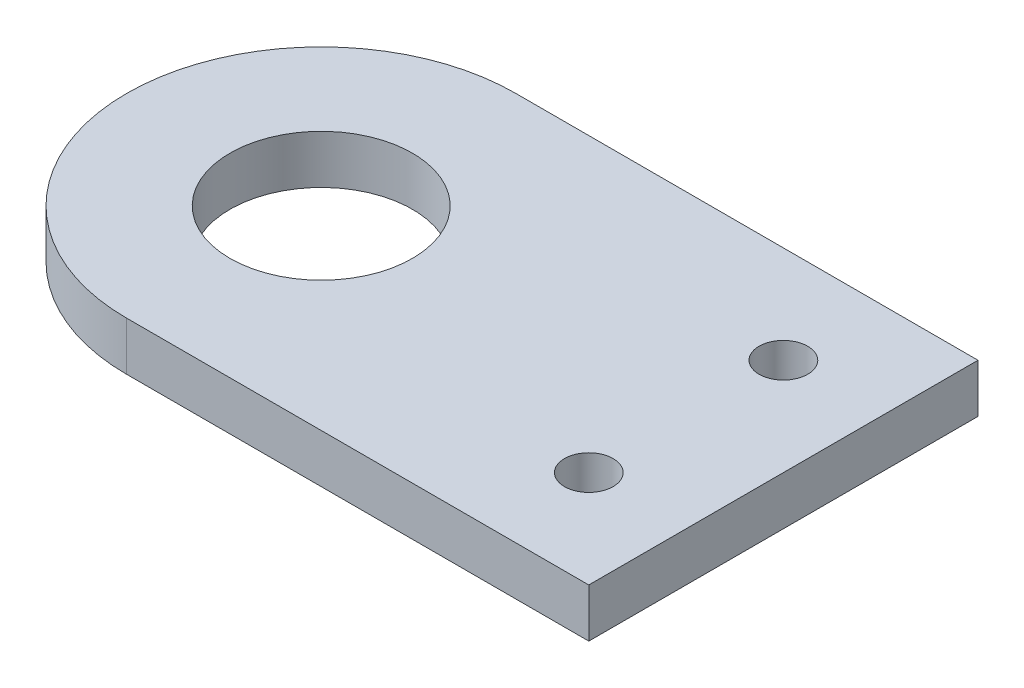
ISO-10303-21;
HEADER;
FILE_DESCRIPTION(('STEP AP214'),'2;1');
FILE_NAME('part.step','',(''),(''),'','','');
FILE_SCHEMA(('AUTOMOTIVE_DESIGN { 1 0 10303 214 1 1 1 1 }'));
ENDSEC;
DATA;
#1=APPLICATION_CONTEXT('core data for automotive mechanical design processes');
#2=APPLICATION_PROTOCOL_DEFINITION('international standard','automotive_design',2000,#1);
#3=PRODUCT_CONTEXT('',#1,'mechanical');
#4=PRODUCT('Part','Part','',(#3));
#5=PRODUCT_RELATED_PRODUCT_CATEGORY('part','',(#4));
#6=PRODUCT_DEFINITION_FORMATION('','',#4);
#7=PRODUCT_DEFINITION_CONTEXT('part definition',#1,'design');
#8=PRODUCT_DEFINITION('design','',#6,#7);
#9=PRODUCT_DEFINITION_SHAPE('','',#8);
#10=(LENGTH_UNIT() NAMED_UNIT(*) SI_UNIT(.MILLI.,.METRE.));
#11=(NAMED_UNIT(*) PLANE_ANGLE_UNIT() SI_UNIT($,.RADIAN.));
#12=(NAMED_UNIT(*) SI_UNIT($,.STERADIAN.) SOLID_ANGLE_UNIT());
#13=UNCERTAINTY_MEASURE_WITH_UNIT(LENGTH_MEASURE(1.E-05),#10,'distance_accuracy_value','');
#14=(GEOMETRIC_REPRESENTATION_CONTEXT(3) GLOBAL_UNCERTAINTY_ASSIGNED_CONTEXT((#13)) GLOBAL_UNIT_ASSIGNED_CONTEXT((#10,
#11,#12)) REPRESENTATION_CONTEXT('',''));
#15=CARTESIAN_POINT('',(0.,0.,0.));
#16=DIRECTION('',(0.,0.,1.));
#17=DIRECTION('',(1.,0.,0.));
#18=AXIS2_PLACEMENT_3D('',#15,#16,#17);
#19=CARTESIAN_POINT('',(0.,4.,0.));
#20=DIRECTION('',(0.,-1.,0.));
#21=DIRECTION('',(0.,0.,-1.));
#22=AXIS2_PLACEMENT_3D('',#19,#20,#21);
#23=CYLINDRICAL_SURFACE('',#22,16.);
#24=CARTESIAN_POINT('',(0.,0.,0.));
#25=DIRECTION('',(0.,1.,0.));
#26=DIRECTION('',(0.,0.,1.));
#27=AXIS2_PLACEMENT_3D('',#24,#25,#26);
#28=CIRCLE('',#27,16.);
#29=CARTESIAN_POINT('',(0.,0.,-16.));
#30=VERTEX_POINT('',#29);
#31=CARTESIAN_POINT('',(0.,0.,16.));
#32=VERTEX_POINT('',#31);
#33=EDGE_CURVE('E103',#30,#32,#28,.T.);
#34=ORIENTED_EDGE('',*,*,#33,.T.);
#35=DIRECTION('',(0.,-1.,0.));
#36=VECTOR('',#35,1.);
#37=CARTESIAN_POINT('',(0.,4.,16.));
#38=LINE('',#37,#36);
#39=CARTESIAN_POINT('',(0.,4.,16.));
#40=VERTEX_POINT('',#39);
#41=EDGE_CURVE('E12',#40,#32,#38,.T.);
#42=ORIENTED_EDGE('',*,*,#41,.F.);
#43=CARTESIAN_POINT('',(0.,4.,0.));
#44=DIRECTION('',(0.,1.,0.));
#45=DIRECTION('',(0.,0.,1.));
#46=AXIS2_PLACEMENT_3D('',#43,#44,#45);
#47=CIRCLE('',#46,16.);
#48=CARTESIAN_POINT('',(0.,4.,-16.));
#49=VERTEX_POINT('',#48);
#50=EDGE_CURVE('E77',#49,#40,#47,.T.);
#51=ORIENTED_EDGE('',*,*,#50,.F.);
#52=DIRECTION('',(0.,-1.,0.));
#53=VECTOR('',#52,1.);
#54=CARTESIAN_POINT('',(0.,4.,-16.));
#55=LINE('',#54,#53);
#56=EDGE_CURVE('E53',#49,#30,#55,.T.);
#57=ORIENTED_EDGE('',*,*,#56,.T.);
#58=EDGE_LOOP('',(#34,#42,#51,#57));
#59=FACE_BOUND('',#58,.T.);
#60=ADVANCED_FACE('F36',(#59),#23,.T.);
#61=CARTESIAN_POINT('',(0.,4.,16.));
#62=DIRECTION('',(0.,0.,1.));
#63=DIRECTION('',(1.,0.,0.));
#64=AXIS2_PLACEMENT_3D('',#61,#62,#63);
#65=PLANE('',#64);
#66=DIRECTION('',(-1.,0.,0.));
#67=VECTOR('',#66,1.);
#68=CARTESIAN_POINT('',(0.,0.,16.));
#69=LINE('',#68,#67);
#70=CARTESIAN_POINT('',(38.,0.,16.));
#71=VERTEX_POINT('',#70);
#72=EDGE_CURVE('E86',#71,#32,#69,.T.);
#73=ORIENTED_EDGE('',*,*,#72,.F.);
#74=DIRECTION('',(0.,-1.,0.));
#75=VECTOR('',#74,1.);
#76=CARTESIAN_POINT('',(38.,4.,16.));
#77=LINE('',#76,#75);
#78=CARTESIAN_POINT('',(38.,4.,16.));
#79=VERTEX_POINT('',#78);
#80=EDGE_CURVE('E45',#79,#71,#77,.T.);
#81=ORIENTED_EDGE('',*,*,#80,.F.);
#82=DIRECTION('',(-1.,0.,0.));
#83=VECTOR('',#82,1.);
#84=CARTESIAN_POINT('',(0.,4.,16.));
#85=LINE('',#84,#83);
#86=EDGE_CURVE('E84',#79,#40,#85,.T.);
#87=ORIENTED_EDGE('',*,*,#86,.T.);
#88=ORIENTED_EDGE('',*,*,#41,.T.);
#89=EDGE_LOOP('',(#73,#81,#87,#88));
#90=FACE_BOUND('',#89,.T.);
#91=ADVANCED_FACE('F83',(#90),#65,.T.);
#92=CARTESIAN_POINT('',(38.,4.,0.));
#93=DIRECTION('',(1.,0.,0.));
#94=DIRECTION('',(0.,0.,-1.));
#95=AXIS2_PLACEMENT_3D('',#92,#93,#94);
#96=PLANE('',#95);
#97=DIRECTION('',(0.,0.,1.));
#98=VECTOR('',#97,1.);
#99=CARTESIAN_POINT('',(38.,0.,0.));
#100=LINE('',#99,#98);
#101=CARTESIAN_POINT('',(38.,0.,-16.));
#102=VERTEX_POINT('',#101);
#103=EDGE_CURVE('E107',#102,#71,#100,.T.);
#104=ORIENTED_EDGE('',*,*,#103,.F.);
#105=DIRECTION('',(0.,-1.,0.));
#106=VECTOR('',#105,1.);
#107=CARTESIAN_POINT('',(38.,4.,-16.));
#108=LINE('',#107,#106);
#109=CARTESIAN_POINT('',(38.,4.,-16.));
#110=VERTEX_POINT('',#109);
#111=EDGE_CURVE('E66',#110,#102,#108,.T.);
#112=ORIENTED_EDGE('',*,*,#111,.F.);
#113=DIRECTION('',(0.,0.,1.));
#114=VECTOR('',#113,1.);
#115=CARTESIAN_POINT('',(38.,4.,0.));
#116=LINE('',#115,#114);
#117=EDGE_CURVE('E92',#110,#79,#116,.T.);
#118=ORIENTED_EDGE('',*,*,#117,.T.);
#119=ORIENTED_EDGE('',*,*,#80,.T.);
#120=EDGE_LOOP('',(#104,#112,#118,#119));
#121=FACE_BOUND('',#120,.T.);
#122=ADVANCED_FACE('F94',(#121),#96,.T.);
#123=CARTESIAN_POINT('',(0.,4.,0.));
#124=DIRECTION('',(0.,-1.,0.));
#125=DIRECTION('',(0.,0.,-1.));
#126=AXIS2_PLACEMENT_3D('',#123,#124,#125);
#127=CYLINDRICAL_SURFACE('',#126,7.5);
#128=CARTESIAN_POINT('',(0.,4.,0.));
#129=DIRECTION('',(0.,1.,0.));
#130=DIRECTION('',(0.,0.,1.));
#131=AXIS2_PLACEMENT_3D('',#128,#129,#130);
#132=CIRCLE('',#131,7.5);
#133=CARTESIAN_POINT('',(0.,4.,7.5));
#134=VERTEX_POINT('',#133);
#135=EDGE_CURVE('E112',#134,#134,#132,.T.);
#136=ORIENTED_EDGE('',*,*,#135,.T.);
#137=EDGE_LOOP('',(#136));
#138=FACE_BOUND('',#137,.T.);
#139=CARTESIAN_POINT('',(0.,0.,0.));
#140=DIRECTION('',(0.,1.,0.));
#141=DIRECTION('',(0.,0.,1.));
#142=AXIS2_PLACEMENT_3D('',#139,#140,#141);
#143=CIRCLE('',#142,7.5);
#144=CARTESIAN_POINT('',(0.,0.,7.5));
#145=VERTEX_POINT('',#144);
#146=EDGE_CURVE('E100',#145,#145,#143,.T.);
#147=ORIENTED_EDGE('',*,*,#146,.F.);
#148=EDGE_LOOP('',(#147));
#149=FACE_BOUND('',#148,.T.);
#150=ADVANCED_FACE('F38',(#138,#149),#127,.F.);
#151=CARTESIAN_POINT('',(0.,4.,-16.));
#152=DIRECTION('',(0.,0.,-1.));
#153=DIRECTION('',(-1.,0.,0.));
#154=AXIS2_PLACEMENT_3D('',#151,#152,#153);
#155=PLANE('',#154);
#156=DIRECTION('',(1.,0.,0.));
#157=VECTOR('',#156,1.);
#158=CARTESIAN_POINT('',(0.,0.,-16.));
#159=LINE('',#158,#157);
#160=EDGE_CURVE('E109',#30,#102,#159,.T.);
#161=ORIENTED_EDGE('',*,*,#160,.F.);
#162=ORIENTED_EDGE('',*,*,#56,.F.);
#163=DIRECTION('',(1.,0.,0.));
#164=VECTOR('',#163,1.);
#165=CARTESIAN_POINT('',(0.,4.,-16.));
#166=LINE('',#165,#164);
#167=EDGE_CURVE('E95',#49,#110,#166,.T.);
#168=ORIENTED_EDGE('',*,*,#167,.T.);
#169=ORIENTED_EDGE('',*,*,#111,.T.);
#170=EDGE_LOOP('',(#161,#162,#168,#169));
#171=FACE_BOUND('',#170,.T.);
#172=ADVANCED_FACE('F144',(#171),#155,.T.);
#173=CARTESIAN_POINT('',(0.,4.,0.));
#174=DIRECTION('',(0.,1.,0.));
#175=DIRECTION('',(0.,0.,1.));
#176=AXIS2_PLACEMENT_3D('',#173,#174,#175);
#177=PLANE('',#176);
#178=CARTESIAN_POINT('',(30.,4.,8.));
#179=DIRECTION('',(0.,1.,0.));
#180=DIRECTION('',(0.,0.,1.));
#181=AXIS2_PLACEMENT_3D('',#178,#179,#180);
#182=CIRCLE('',#181,2.);
#183=CARTESIAN_POINT('',(30.,4.,10.));
#184=VERTEX_POINT('',#183);
#185=EDGE_CURVE('E126',#184,#184,#182,.T.);
#186=ORIENTED_EDGE('',*,*,#185,.F.);
#187=EDGE_LOOP('',(#186));
#188=FACE_BOUND('',#187,.T.);
#189=CARTESIAN_POINT('',(30.,4.,-8.));
#190=DIRECTION('',(0.,1.,0.));
#191=DIRECTION('',(0.,0.,1.));
#192=AXIS2_PLACEMENT_3D('',#189,#190,#191);
#193=CIRCLE('',#192,2.);
#194=CARTESIAN_POINT('',(30.,4.,-6.));
#195=VERTEX_POINT('',#194);
#196=EDGE_CURVE('E120',#195,#195,#193,.T.);
#197=ORIENTED_EDGE('',*,*,#196,.F.);
#198=EDGE_LOOP('',(#197));
#199=FACE_BOUND('',#198,.T.);
#200=ORIENTED_EDGE('',*,*,#135,.F.);
#201=EDGE_LOOP('',(#200));
#202=FACE_BOUND('',#201,.T.);
#203=ORIENTED_EDGE('',*,*,#50,.T.);
#204=ORIENTED_EDGE('',*,*,#86,.F.);
#205=ORIENTED_EDGE('',*,*,#117,.F.);
#206=ORIENTED_EDGE('',*,*,#167,.F.);
#207=EDGE_LOOP('',(#203,#204,#205,#206));
#208=FACE_BOUND('',#207,.T.);
#209=ADVANCED_FACE('F91',(#188,#199,#202,#208),#177,.T.);
#210=CARTESIAN_POINT('',(0.,0.,0.));
#211=DIRECTION('',(0.,1.,0.));
#212=DIRECTION('',(0.,0.,1.));
#213=AXIS2_PLACEMENT_3D('',#210,#211,#212);
#214=PLANE('',#213);
#215=CARTESIAN_POINT('',(30.,0.,8.));
#216=DIRECTION('',(0.,1.,0.));
#217=DIRECTION('',(0.,0.,1.));
#218=AXIS2_PLACEMENT_3D('',#215,#216,#217);
#219=CIRCLE('',#218,2.);
#220=CARTESIAN_POINT('',(30.,0.,10.));
#221=VERTEX_POINT('',#220);
#222=EDGE_CURVE('E104',#221,#221,#219,.T.);
#223=ORIENTED_EDGE('',*,*,#222,.T.);
#224=EDGE_LOOP('',(#223));
#225=FACE_BOUND('',#224,.T.);
#226=CARTESIAN_POINT('',(30.,0.,-8.));
#227=DIRECTION('',(0.,1.,0.));
#228=DIRECTION('',(0.,0.,1.));
#229=AXIS2_PLACEMENT_3D('',#226,#227,#228);
#230=CIRCLE('',#229,2.);
#231=CARTESIAN_POINT('',(30.,0.,-6.));
#232=VERTEX_POINT('',#231);
#233=EDGE_CURVE('E123',#232,#232,#230,.T.);
#234=ORIENTED_EDGE('',*,*,#233,.T.);
#235=EDGE_LOOP('',(#234));
#236=FACE_BOUND('',#235,.T.);
#237=ORIENTED_EDGE('',*,*,#146,.T.);
#238=EDGE_LOOP('',(#237));
#239=FACE_BOUND('',#238,.T.);
#240=ORIENTED_EDGE('',*,*,#33,.F.);
#241=ORIENTED_EDGE('',*,*,#160,.T.);
#242=ORIENTED_EDGE('',*,*,#103,.T.);
#243=ORIENTED_EDGE('',*,*,#72,.T.);
#244=EDGE_LOOP('',(#240,#241,#242,#243));
#245=FACE_BOUND('',#244,.T.);
#246=ADVANCED_FACE('F132',(#225,#236,#239,#245),#214,.F.);
#247=CARTESIAN_POINT('',(30.,0.,-8.));
#248=DIRECTION('',(0.,1.,0.));
#249=DIRECTION('',(0.,0.,1.));
#250=AXIS2_PLACEMENT_3D('',#247,#248,#249);
#251=CYLINDRICAL_SURFACE('',#250,2.);
#252=ORIENTED_EDGE('',*,*,#233,.F.);
#253=EDGE_LOOP('',(#252));
#254=FACE_BOUND('',#253,.T.);
#255=ORIENTED_EDGE('',*,*,#196,.T.);
#256=EDGE_LOOP('',(#255));
#257=FACE_BOUND('',#256,.T.);
#258=ADVANCED_FACE('F138',(#254,#257),#251,.F.);
#259=CARTESIAN_POINT('',(30.,0.,8.));
#260=DIRECTION('',(0.,1.,0.));
#261=DIRECTION('',(0.,0.,1.));
#262=AXIS2_PLACEMENT_3D('',#259,#260,#261);
#263=CYLINDRICAL_SURFACE('',#262,2.);
#264=ORIENTED_EDGE('',*,*,#222,.F.);
#265=EDGE_LOOP('',(#264));
#266=FACE_BOUND('',#265,.T.);
#267=ORIENTED_EDGE('',*,*,#185,.T.);
#268=EDGE_LOOP('',(#267));
#269=FACE_BOUND('',#268,.T.);
#270=ADVANCED_FACE('F135',(#266,#269),#263,.F.);
#271=CLOSED_SHELL('',(#60,#91,#122,#150,#172,#209,#246,#258,#270));
#272=MANIFOLD_SOLID_BREP('B2',#271);
#273=ADVANCED_BREP_SHAPE_REPRESENTATION('',(#18,#272),#14);
#274=SHAPE_DEFINITION_REPRESENTATION(#9,#273);
ENDSEC;
END-ISO-10303-21;
